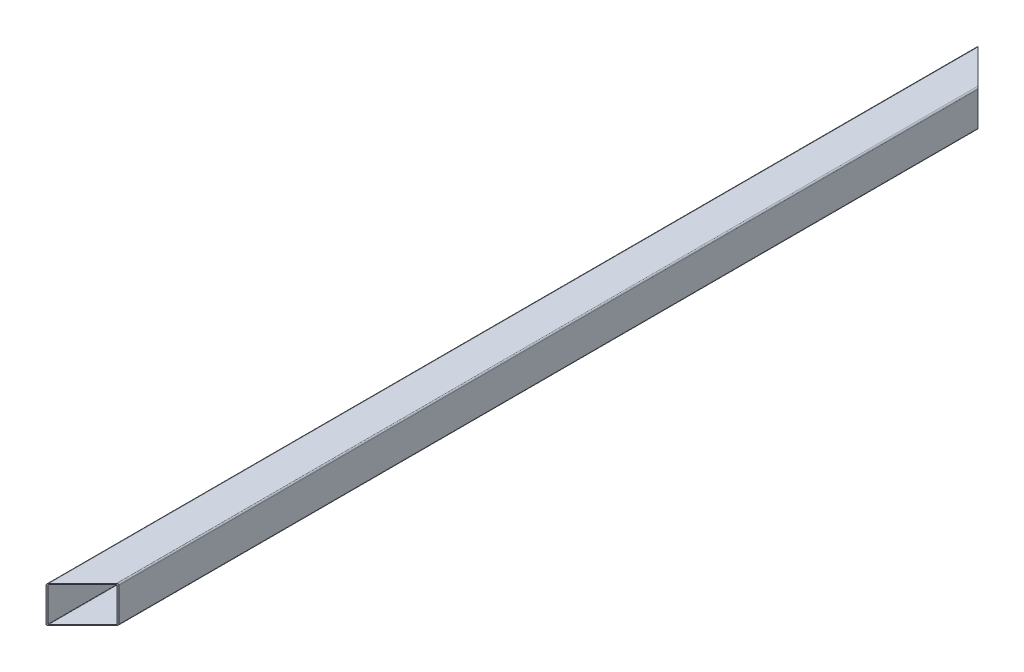
ISO-10303-21;
HEADER;
FILE_DESCRIPTION(('STEP AP214'),'2;1');
FILE_NAME('part.step','',(''),(''),'','','');
FILE_SCHEMA(('AUTOMOTIVE_DESIGN { 1 0 10303 214 1 1 1 1 }'));
ENDSEC;
DATA;
#1=APPLICATION_CONTEXT('core data for automotive mechanical design processes');
#2=APPLICATION_PROTOCOL_DEFINITION('international standard','automotive_design',2000,#1);
#3=PRODUCT_CONTEXT('',#1,'mechanical');
#4=PRODUCT('Part','Part','',(#3));
#5=PRODUCT_RELATED_PRODUCT_CATEGORY('part','',(#4));
#6=PRODUCT_DEFINITION_FORMATION('','',#4);
#7=PRODUCT_DEFINITION_CONTEXT('part definition',#1,'design');
#8=PRODUCT_DEFINITION('design','',#6,#7);
#9=PRODUCT_DEFINITION_SHAPE('','',#8);
#10=(LENGTH_UNIT() NAMED_UNIT(*) SI_UNIT(.MILLI.,.METRE.));
#11=(NAMED_UNIT(*) PLANE_ANGLE_UNIT() SI_UNIT($,.RADIAN.));
#12=(NAMED_UNIT(*) SI_UNIT($,.STERADIAN.) SOLID_ANGLE_UNIT());
#13=UNCERTAINTY_MEASURE_WITH_UNIT(LENGTH_MEASURE(1.E-05),#10,'distance_accuracy_value','');
#14=(GEOMETRIC_REPRESENTATION_CONTEXT(3) GLOBAL_UNCERTAINTY_ASSIGNED_CONTEXT((#13)) GLOBAL_UNIT_ASSIGNED_CONTEXT((#10,
#11,#12)) REPRESENTATION_CONTEXT('',''));
#15=CARTESIAN_POINT('',(0.,0.,0.));
#16=DIRECTION('',(0.,0.,1.));
#17=DIRECTION('',(1.,0.,0.));
#18=AXIS2_PLACEMENT_3D('',#15,#16,#17);
#19=CARTESIAN_POINT('',(-18.5,18.5,-1020.));
#20=DIRECTION('',(0.,0.,1.));
#21=DIRECTION('',(1.,0.,0.));
#22=AXIS2_PLACEMENT_3D('',#19,#20,#21);
#23=CYLINDRICAL_SURFACE('',#22,1.5);
#24=DIRECTION('',(0.,0.,1.));
#25=VECTOR('',#24,1.);
#26=CARTESIAN_POINT('',(-20.,18.5,-1020.));
#27=LINE('',#26,#25);
#28=CARTESIAN_POINT('',(-20.,18.5,-1020.));
#29=VERTEX_POINT('',#28);
#30=CARTESIAN_POINT('',(-20.,18.5,0.));
#31=VERTEX_POINT('',#30);
#32=EDGE_CURVE('E201',#29,#31,#27,.T.);
#33=ORIENTED_EDGE('',*,*,#32,.T.);
#34=CARTESIAN_POINT('',(-18.5,18.5,-1.50000000000006));
#35=DIRECTION('',(-0.707106781186549,0.,-0.707106781186546));
#36=DIRECTION('',(-0.707106781186546,0.,0.707106781186549));
#37=AXIS2_PLACEMENT_3D('',#34,#35,#36);
#38=ELLIPSE('',#37,2.12132034355964,1.5);
#39=CARTESIAN_POINT('',(-18.5,20.,-1.49999999999995));
#40=VERTEX_POINT('',#39);
#41=EDGE_CURVE('E181',#31,#40,#38,.T.);
#42=ORIENTED_EDGE('',*,*,#41,.T.);
#43=DIRECTION('',(0.,0.,1.));
#44=VECTOR('',#43,1.);
#45=CARTESIAN_POINT('',(-18.5,20.,-1020.));
#46=LINE('',#45,#44);
#47=CARTESIAN_POINT('',(-18.5,20.,-1018.5));
#48=VERTEX_POINT('',#47);
#49=EDGE_CURVE('E12',#48,#40,#46,.T.);
#50=ORIENTED_EDGE('',*,*,#49,.F.);
#51=CARTESIAN_POINT('',(-18.5,18.5,-1018.5));
#52=DIRECTION('',(-0.707106781186539,0.,0.707106781186556));
#53=DIRECTION('',(0.707106781186556,0.,0.707106781186539));
#54=AXIS2_PLACEMENT_3D('',#51,#52,#53);
#55=ELLIPSE('',#54,2.12132034355961,1.5);
#56=EDGE_CURVE('E187',#48,#29,#55,.T.);
#57=ORIENTED_EDGE('',*,*,#56,.T.);
#58=EDGE_LOOP('',(#33,#42,#50,#57));
#59=FACE_BOUND('',#58,.T.);
#60=ADVANCED_FACE('F61',(#59),#23,.T.);
#61=CARTESIAN_POINT('',(-18.5,20.,-1020.));
#62=DIRECTION('',(0.,-1.,0.));
#63=DIRECTION('',(0.,0.,-1.));
#64=AXIS2_PLACEMENT_3D('',#61,#62,#63);
#65=PLANE('',#64);
#66=ORIENTED_EDGE('',*,*,#49,.T.);
#67=DIRECTION('',(0.707106781186546,0.,-0.707106781186549));
#68=VECTOR('',#67,1.);
#69=CARTESIAN_POINT('',(490.75,20.,-510.750000000002));
#70=LINE('',#69,#68);
#71=CARTESIAN_POINT('',(18.5,20.,-38.5000000000002));
#72=VERTEX_POINT('',#71);
#73=EDGE_CURVE('E267',#40,#72,#70,.T.);
#74=ORIENTED_EDGE('',*,*,#73,.T.);
#75=DIRECTION('',(0.,0.,1.));
#76=VECTOR('',#75,1.);
#77=CARTESIAN_POINT('',(18.5,20.,-1020.));
#78=LINE('',#77,#76);
#79=CARTESIAN_POINT('',(18.5,20.,-981.500000000001));
#80=VERTEX_POINT('',#79);
#81=EDGE_CURVE('E70',#80,#72,#78,.T.);
#82=ORIENTED_EDGE('',*,*,#81,.F.);
#83=DIRECTION('',(-0.707106781186556,0.,-0.707106781186539));
#84=VECTOR('',#83,1.);
#85=CARTESIAN_POINT('',(-19.25,20.,-1019.25));
#86=LINE('',#85,#84);
#87=EDGE_CURVE('E298',#80,#48,#86,.T.);
#88=ORIENTED_EDGE('',*,*,#87,.T.);
#89=EDGE_LOOP('',(#66,#74,#82,#88));
#90=FACE_BOUND('',#89,.T.);
#91=ADVANCED_FACE('F308',(#90),#65,.F.);
#92=CARTESIAN_POINT('',(18.5,18.5,-1020.));
#93=DIRECTION('',(0.,0.,1.));
#94=DIRECTION('',(1.,0.,0.));
#95=AXIS2_PLACEMENT_3D('',#92,#93,#94);
#96=CYLINDRICAL_SURFACE('',#95,1.5);
#97=ORIENTED_EDGE('',*,*,#81,.T.);
#98=CARTESIAN_POINT('',(18.5,18.5,-38.5000000000002));
#99=DIRECTION('',(-0.707106781186549,0.,-0.707106781186546));
#100=DIRECTION('',(-0.707106781186546,0.,0.707106781186549));
#101=AXIS2_PLACEMENT_3D('',#98,#99,#100);
#102=ELLIPSE('',#101,2.12132034355964,1.5);
#103=CARTESIAN_POINT('',(20.,18.5,-40.0000000000001));
#104=VERTEX_POINT('',#103);
#105=EDGE_CURVE('E264',#72,#104,#102,.T.);
#106=ORIENTED_EDGE('',*,*,#105,.T.);
#107=DIRECTION('',(0.,0.,1.));
#108=VECTOR('',#107,1.);
#109=CARTESIAN_POINT('',(20.,18.5,-1020.));
#110=LINE('',#109,#108);
#111=CARTESIAN_POINT('',(20.,18.5,-980.000000000001));
#112=VERTEX_POINT('',#111);
#113=EDGE_CURVE('E212',#112,#104,#110,.T.);
#114=ORIENTED_EDGE('',*,*,#113,.F.);
#115=CARTESIAN_POINT('',(18.5,18.5,-981.500000000001));
#116=DIRECTION('',(-0.707106781186539,0.,0.707106781186556));
#117=DIRECTION('',(0.707106781186556,0.,0.707106781186539));
#118=AXIS2_PLACEMENT_3D('',#115,#116,#117);
#119=ELLIPSE('',#118,2.12132034355961,1.5);
#120=EDGE_CURVE('E295',#112,#80,#119,.T.);
#121=ORIENTED_EDGE('',*,*,#120,.T.);
#122=EDGE_LOOP('',(#97,#106,#114,#121));
#123=FACE_BOUND('',#122,.T.);
#124=ADVANCED_FACE('F312',(#123),#96,.T.);
#125=CARTESIAN_POINT('',(20.,-18.5,-1020.));
#126=DIRECTION('',(-1.,0.,0.));
#127=DIRECTION('',(0.,0.,1.));
#128=AXIS2_PLACEMENT_3D('',#125,#126,#127);
#129=PLANE('',#128);
#130=ORIENTED_EDGE('',*,*,#113,.T.);
#131=DIRECTION('',(0.,-1.,0.));
#132=VECTOR('',#131,1.);
#133=CARTESIAN_POINT('',(20.,-18.5,-40.0000000000001));
#134=LINE('',#133,#132);
#135=CARTESIAN_POINT('',(20.,-18.5,-40.0000000000003));
#136=VERTEX_POINT('',#135);
#137=EDGE_CURVE('E261',#104,#136,#134,.T.);
#138=ORIENTED_EDGE('',*,*,#137,.T.);
#139=DIRECTION('',(0.,0.,1.));
#140=VECTOR('',#139,1.);
#141=CARTESIAN_POINT('',(20.,-18.5,-1020.));
#142=LINE('',#141,#140);
#143=CARTESIAN_POINT('',(20.,-18.5,-980.000000000001));
#144=VERTEX_POINT('',#143);
#145=EDGE_CURVE('E209',#144,#136,#142,.T.);
#146=ORIENTED_EDGE('',*,*,#145,.F.);
#147=DIRECTION('',(0.,1.,0.));
#148=VECTOR('',#147,1.);
#149=CARTESIAN_POINT('',(20.,-18.5,-980.000000000001));
#150=LINE('',#149,#148);
#151=EDGE_CURVE('E292',#144,#112,#150,.T.);
#152=ORIENTED_EDGE('',*,*,#151,.T.);
#153=EDGE_LOOP('',(#130,#138,#146,#152));
#154=FACE_BOUND('',#153,.T.);
#155=ADVANCED_FACE('F314',(#154),#129,.F.);
#156=CARTESIAN_POINT('',(18.5,-18.5,-1020.));
#157=DIRECTION('',(0.,0.,1.));
#158=DIRECTION('',(1.,0.,0.));
#159=AXIS2_PLACEMENT_3D('',#156,#157,#158);
#160=CYLINDRICAL_SURFACE('',#159,1.5);
#161=ORIENTED_EDGE('',*,*,#145,.T.);
#162=CARTESIAN_POINT('',(18.5,-18.5,-38.5000000000002));
#163=DIRECTION('',(-0.707106781186549,0.,-0.707106781186546));
#164=DIRECTION('',(-0.707106781186546,0.,0.707106781186549));
#165=AXIS2_PLACEMENT_3D('',#162,#163,#164);
#166=ELLIPSE('',#165,2.12132034355965,1.5);
#167=CARTESIAN_POINT('',(18.5,-20.,-38.5000000000001));
#168=VERTEX_POINT('',#167);
#169=EDGE_CURVE('E258',#136,#168,#166,.T.);
#170=ORIENTED_EDGE('',*,*,#169,.T.);
#171=DIRECTION('',(0.,0.,1.));
#172=VECTOR('',#171,1.);
#173=CARTESIAN_POINT('',(18.5,-20.,-1020.));
#174=LINE('',#173,#172);
#175=CARTESIAN_POINT('',(18.5,-20.,-981.500000000001));
#176=VERTEX_POINT('',#175);
#177=EDGE_CURVE('E203',#176,#168,#174,.T.);
#178=ORIENTED_EDGE('',*,*,#177,.F.);
#179=CARTESIAN_POINT('',(18.5,-18.5,-981.500000000001));
#180=DIRECTION('',(-0.707106781186539,0.,0.707106781186556));
#181=DIRECTION('',(0.707106781186556,0.,0.707106781186539));
#182=AXIS2_PLACEMENT_3D('',#179,#180,#181);
#183=ELLIPSE('',#182,2.12132034355962,1.5);
#184=EDGE_CURVE('E289',#176,#144,#183,.T.);
#185=ORIENTED_EDGE('',*,*,#184,.T.);
#186=EDGE_LOOP('',(#161,#170,#178,#185));
#187=FACE_BOUND('',#186,.T.);
#188=ADVANCED_FACE('F318',(#187),#160,.T.);
#189=CARTESIAN_POINT('',(18.5,-20.,-1020.));
#190=DIRECTION('',(0.,1.,0.));
#191=DIRECTION('',(0.,0.,1.));
#192=AXIS2_PLACEMENT_3D('',#189,#190,#191);
#193=PLANE('',#192);
#194=ORIENTED_EDGE('',*,*,#177,.T.);
#195=DIRECTION('',(-0.707106781186546,0.,0.707106781186549));
#196=VECTOR('',#195,1.);
#197=CARTESIAN_POINT('',(509.25,-20.,-529.250000000002));
#198=LINE('',#197,#196);
#199=CARTESIAN_POINT('',(-18.5,-20.,-1.50000000000006));
#200=VERTEX_POINT('',#199);
#201=EDGE_CURVE('E198',#168,#200,#198,.T.);
#202=ORIENTED_EDGE('',*,*,#201,.T.);
#203=DIRECTION('',(0.,0.,1.));
#204=VECTOR('',#203,1.);
#205=CARTESIAN_POINT('',(-18.5,-20.,-1020.));
#206=LINE('',#205,#204);
#207=CARTESIAN_POINT('',(-18.5,-20.,-1018.5));
#208=VERTEX_POINT('',#207);
#209=EDGE_CURVE('E197',#208,#200,#206,.T.);
#210=ORIENTED_EDGE('',*,*,#209,.F.);
#211=DIRECTION('',(0.707106781186556,0.,0.707106781186539));
#212=VECTOR('',#211,1.);
#213=CARTESIAN_POINT('',(-0.749999999999532,-20.,-1000.75));
#214=LINE('',#213,#212);
#215=EDGE_CURVE('E286',#208,#176,#214,.T.);
#216=ORIENTED_EDGE('',*,*,#215,.T.);
#217=EDGE_LOOP('',(#194,#202,#210,#216));
#218=FACE_BOUND('',#217,.T.);
#219=ADVANCED_FACE('F320',(#218),#193,.F.);
#220=CARTESIAN_POINT('',(-18.5,-18.5,-1020.));
#221=DIRECTION('',(0.,0.,1.));
#222=DIRECTION('',(1.,0.,0.));
#223=AXIS2_PLACEMENT_3D('',#220,#221,#222);
#224=CYLINDRICAL_SURFACE('',#223,1.5);
#225=ORIENTED_EDGE('',*,*,#209,.T.);
#226=CARTESIAN_POINT('',(-18.5,-18.5,-1.50000000000006));
#227=DIRECTION('',(-0.707106781186549,0.,-0.707106781186546));
#228=DIRECTION('',(-0.707106781186546,0.,0.707106781186549));
#229=AXIS2_PLACEMENT_3D('',#226,#227,#228);
#230=ELLIPSE('',#229,2.12132034355965,1.5);
#231=CARTESIAN_POINT('',(-20.,-18.5,0.));
#232=VERTEX_POINT('',#231);
#233=EDGE_CURVE('E178',#200,#232,#230,.T.);
#234=ORIENTED_EDGE('',*,*,#233,.T.);
#235=DIRECTION('',(0.,0.,1.));
#236=VECTOR('',#235,1.);
#237=CARTESIAN_POINT('',(-20.,-18.5,-1020.));
#238=LINE('',#237,#236);
#239=CARTESIAN_POINT('',(-20.,-18.5,-1020.));
#240=VERTEX_POINT('',#239);
#241=EDGE_CURVE('E194',#240,#232,#238,.T.);
#242=ORIENTED_EDGE('',*,*,#241,.F.);
#243=CARTESIAN_POINT('',(-18.5,-18.5,-1018.5));
#244=DIRECTION('',(-0.707106781186539,0.,0.707106781186556));
#245=DIRECTION('',(0.707106781186556,0.,0.707106781186539));
#246=AXIS2_PLACEMENT_3D('',#243,#244,#245);
#247=ELLIPSE('',#246,2.12132034355962,1.5);
#248=EDGE_CURVE('E284',#240,#208,#247,.T.);
#249=ORIENTED_EDGE('',*,*,#248,.T.);
#250=EDGE_LOOP('',(#225,#234,#242,#249));
#251=FACE_BOUND('',#250,.T.);
#252=ADVANCED_FACE('F192',(#251),#224,.T.);
#253=CARTESIAN_POINT('',(18.5,18.5,-1020.));
#254=DIRECTION('',(0.,0.,1.));
#255=DIRECTION('',(1.,0.,0.));
#256=AXIS2_PLACEMENT_3D('',#253,#254,#255);
#257=CYLINDRICAL_SURFACE('',#256,0.3);
#258=CARTESIAN_POINT('',(18.5,18.5,-38.5000000000002));
#259=DIRECTION('',(-0.707106781186549,0.,-0.707106781186546));
#260=DIRECTION('',(-0.707106781186546,0.,0.707106781186549));
#261=AXIS2_PLACEMENT_3D('',#258,#259,#260);
#262=ELLIPSE('',#261,0.424264068711929,0.3);
#263=CARTESIAN_POINT('',(18.5,18.8,-38.5000000000001));
#264=VERTEX_POINT('',#263);
#265=CARTESIAN_POINT('',(18.8,18.5,-38.8000000000002));
#266=VERTEX_POINT('',#265);
#267=EDGE_CURVE('E78',#264,#266,#262,.T.);
#268=ORIENTED_EDGE('',*,*,#267,.F.);
#269=DIRECTION('',(0.,0.,1.));
#270=VECTOR('',#269,1.);
#271=CARTESIAN_POINT('',(18.5,18.8,-1020.));
#272=LINE('',#271,#270);
#273=CARTESIAN_POINT('',(18.5,18.8,-981.500000000001));
#274=VERTEX_POINT('',#273);
#275=EDGE_CURVE('E65',#274,#264,#272,.T.);
#276=ORIENTED_EDGE('',*,*,#275,.F.);
#277=CARTESIAN_POINT('',(18.5,18.5,-981.500000000001));
#278=DIRECTION('',(-0.707106781186539,0.,0.707106781186556));
#279=DIRECTION('',(0.707106781186556,0.,0.707106781186539));
#280=AXIS2_PLACEMENT_3D('',#277,#278,#279);
#281=ELLIPSE('',#280,0.424264068711923,0.3);
#282=CARTESIAN_POINT('',(18.8,18.5,-981.200000000001));
#283=VERTEX_POINT('',#282);
#284=EDGE_CURVE('E250',#283,#274,#281,.T.);
#285=ORIENTED_EDGE('',*,*,#284,.F.);
#286=DIRECTION('',(0.,0.,1.));
#287=VECTOR('',#286,1.);
#288=CARTESIAN_POINT('',(18.8,18.5,-1020.));
#289=LINE('',#288,#287);
#290=EDGE_CURVE('E217',#283,#266,#289,.T.);
#291=ORIENTED_EDGE('',*,*,#290,.T.);
#292=EDGE_LOOP('',(#268,#276,#285,#291));
#293=FACE_BOUND('',#292,.T.);
#294=ADVANCED_FACE('F63',(#293),#257,.F.);
#295=CARTESIAN_POINT('',(-18.5,18.8,-1020.));
#296=DIRECTION('',(0.,-1.,0.));
#297=DIRECTION('',(0.,0.,-1.));
#298=AXIS2_PLACEMENT_3D('',#295,#296,#297);
#299=PLANE('',#298);
#300=DIRECTION('',(0.707106781186546,0.,-0.707106781186549));
#301=VECTOR('',#300,1.);
#302=CARTESIAN_POINT('',(490.75,18.8,-510.750000000002));
#303=LINE('',#302,#301);
#304=CARTESIAN_POINT('',(-18.5,18.8,-1.50000000000006));
#305=VERTEX_POINT('',#304);
#306=EDGE_CURVE('E246',#305,#264,#303,.T.);
#307=ORIENTED_EDGE('',*,*,#306,.F.);
#308=DIRECTION('',(0.,0.,1.));
#309=VECTOR('',#308,1.);
#310=CARTESIAN_POINT('',(-18.5,18.8,-1020.));
#311=LINE('',#310,#309);
#312=CARTESIAN_POINT('',(-18.5,18.8,-1018.5));
#313=VERTEX_POINT('',#312);
#314=EDGE_CURVE('E234',#313,#305,#311,.T.);
#315=ORIENTED_EDGE('',*,*,#314,.F.);
#316=DIRECTION('',(-0.707106781186556,0.,-0.707106781186539));
#317=VECTOR('',#316,1.);
#318=CARTESIAN_POINT('',(-19.25,18.8,-1019.25));
#319=LINE('',#318,#317);
#320=EDGE_CURVE('E247',#274,#313,#319,.T.);
#321=ORIENTED_EDGE('',*,*,#320,.F.);
#322=ORIENTED_EDGE('',*,*,#275,.T.);
#323=EDGE_LOOP('',(#307,#315,#321,#322));
#324=FACE_BOUND('',#323,.T.);
#325=ADVANCED_FACE('F245',(#324),#299,.T.);
#326=CARTESIAN_POINT('',(-18.5,18.5,-1020.));
#327=DIRECTION('',(0.,0.,1.));
#328=DIRECTION('',(1.,0.,0.));
#329=AXIS2_PLACEMENT_3D('',#326,#327,#328);
#330=CYLINDRICAL_SURFACE('',#329,0.3);
#331=CARTESIAN_POINT('',(-18.5,18.5,-1.50000000000006));
#332=DIRECTION('',(-0.707106781186549,0.,-0.707106781186546));
#333=DIRECTION('',(-0.707106781186546,0.,0.707106781186549));
#334=AXIS2_PLACEMENT_3D('',#331,#332,#333);
#335=ELLIPSE('',#334,0.424264068711929,0.3);
#336=CARTESIAN_POINT('',(-18.8,18.5,-1.20000000000009));
#337=VERTEX_POINT('',#336);
#338=EDGE_CURVE('E253',#337,#305,#335,.T.);
#339=ORIENTED_EDGE('',*,*,#338,.F.);
#340=DIRECTION('',(0.,0.,1.));
#341=VECTOR('',#340,1.);
#342=CARTESIAN_POINT('',(-18.8,18.5,-1020.));
#343=LINE('',#342,#341);
#344=CARTESIAN_POINT('',(-18.8,18.5,-1018.8));
#345=VERTEX_POINT('',#344);
#346=EDGE_CURVE('E232',#345,#337,#343,.T.);
#347=ORIENTED_EDGE('',*,*,#346,.F.);
#348=CARTESIAN_POINT('',(-18.5,18.5,-1018.5));
#349=DIRECTION('',(-0.707106781186539,0.,0.707106781186556));
#350=DIRECTION('',(0.707106781186556,0.,0.707106781186539));
#351=AXIS2_PLACEMENT_3D('',#348,#349,#350);
#352=ELLIPSE('',#351,0.424264068711923,0.3);
#353=EDGE_CURVE('E280',#313,#345,#352,.T.);
#354=ORIENTED_EDGE('',*,*,#353,.F.);
#355=ORIENTED_EDGE('',*,*,#314,.T.);
#356=EDGE_LOOP('',(#339,#347,#354,#355));
#357=FACE_BOUND('',#356,.T.);
#358=ADVANCED_FACE('F356',(#357),#330,.F.);
#359=CARTESIAN_POINT('',(-18.8,18.5,-1020.));
#360=DIRECTION('',(1.,0.,0.));
#361=DIRECTION('',(0.,0.,-1.));
#362=AXIS2_PLACEMENT_3D('',#359,#360,#361);
#363=PLANE('',#362);
#364=DIRECTION('',(0.,1.,0.));
#365=VECTOR('',#364,1.);
#366=CARTESIAN_POINT('',(-18.8,18.5,-1.20000000000009));
#367=LINE('',#366,#365);
#368=CARTESIAN_POINT('',(-18.8,-18.5,-1.20000000000009));
#369=VERTEX_POINT('',#368);
#370=EDGE_CURVE('E513',#369,#337,#367,.T.);
#371=ORIENTED_EDGE('',*,*,#370,.F.);
#372=DIRECTION('',(0.,0.,1.));
#373=VECTOR('',#372,1.);
#374=CARTESIAN_POINT('',(-18.8,-18.5,-1020.));
#375=LINE('',#374,#373);
#376=CARTESIAN_POINT('',(-18.8,-18.5,-1018.8));
#377=VERTEX_POINT('',#376);
#378=EDGE_CURVE('E229',#377,#369,#375,.T.);
#379=ORIENTED_EDGE('',*,*,#378,.F.);
#380=DIRECTION('',(0.,-1.,0.));
#381=VECTOR('',#380,1.);
#382=CARTESIAN_POINT('',(-18.8,18.5,-1018.8));
#383=LINE('',#382,#381);
#384=EDGE_CURVE('E278',#345,#377,#383,.T.);
#385=ORIENTED_EDGE('',*,*,#384,.F.);
#386=ORIENTED_EDGE('',*,*,#346,.T.);
#387=EDGE_LOOP('',(#371,#379,#385,#386));
#388=FACE_BOUND('',#387,.T.);
#389=ADVANCED_FACE('F352',(#388),#363,.T.);
#390=CARTESIAN_POINT('',(-18.5,-18.5,-1020.));
#391=DIRECTION('',(0.,0.,1.));
#392=DIRECTION('',(1.,0.,0.));
#393=AXIS2_PLACEMENT_3D('',#390,#391,#392);
#394=CYLINDRICAL_SURFACE('',#393,0.300000000000005);
#395=CARTESIAN_POINT('',(-18.5,-18.5,-1.50000000000006));
#396=DIRECTION('',(-0.707106781186549,0.,-0.707106781186546));
#397=DIRECTION('',(-0.707106781186546,0.,0.707106781186549));
#398=AXIS2_PLACEMENT_3D('',#395,#396,#397);
#399=ELLIPSE('',#398,0.424264068711936,0.300000000000005);
#400=CARTESIAN_POINT('',(-18.5,-18.8,-1.49999999999995));
#401=VERTEX_POINT('',#400);
#402=EDGE_CURVE('E508',#401,#369,#399,.T.);
#403=ORIENTED_EDGE('',*,*,#402,.F.);
#404=DIRECTION('',(0.,0.,1.));
#405=VECTOR('',#404,1.);
#406=CARTESIAN_POINT('',(-18.5,-18.8,-1020.));
#407=LINE('',#406,#405);
#408=CARTESIAN_POINT('',(-18.5,-18.8,-1018.5));
#409=VERTEX_POINT('',#408);
#410=EDGE_CURVE('E226',#409,#401,#407,.T.);
#411=ORIENTED_EDGE('',*,*,#410,.F.);
#412=CARTESIAN_POINT('',(-18.5,-18.5,-1018.5));
#413=DIRECTION('',(-0.707106781186539,0.,0.707106781186556));
#414=DIRECTION('',(0.707106781186556,0.,0.707106781186539));
#415=AXIS2_PLACEMENT_3D('',#412,#413,#414);
#416=ELLIPSE('',#415,0.424264068711931,0.300000000000005);
#417=EDGE_CURVE('E276',#377,#409,#416,.T.);
#418=ORIENTED_EDGE('',*,*,#417,.F.);
#419=ORIENTED_EDGE('',*,*,#378,.T.);
#420=EDGE_LOOP('',(#403,#411,#418,#419));
#421=FACE_BOUND('',#420,.T.);
#422=ADVANCED_FACE('F348',(#421),#394,.F.);
#423=CARTESIAN_POINT('',(18.5,-18.8,-1020.));
#424=DIRECTION('',(0.,1.,0.));
#425=DIRECTION('',(0.,0.,1.));
#426=AXIS2_PLACEMENT_3D('',#423,#424,#425);
#427=PLANE('',#426);
#428=DIRECTION('',(-0.707106781186546,0.,0.707106781186549));
#429=VECTOR('',#428,1.);
#430=CARTESIAN_POINT('',(509.25,-18.8,-529.250000000002));
#431=LINE('',#430,#429);
#432=CARTESIAN_POINT('',(18.5,-18.8,-38.5000000000002));
#433=VERTEX_POINT('',#432);
#434=EDGE_CURVE('E505',#433,#401,#431,.T.);
#435=ORIENTED_EDGE('',*,*,#434,.F.);
#436=DIRECTION('',(0.,0.,1.));
#437=VECTOR('',#436,1.);
#438=CARTESIAN_POINT('',(18.5,-18.8,-1020.));
#439=LINE('',#438,#437);
#440=CARTESIAN_POINT('',(18.5,-18.8,-981.500000000001));
#441=VERTEX_POINT('',#440);
#442=EDGE_CURVE('E223',#441,#433,#439,.T.);
#443=ORIENTED_EDGE('',*,*,#442,.F.);
#444=DIRECTION('',(0.707106781186556,0.,0.707106781186539));
#445=VECTOR('',#444,1.);
#446=CARTESIAN_POINT('',(-0.749999999999532,-18.8,-1000.75));
#447=LINE('',#446,#445);
#448=EDGE_CURVE('E274',#409,#441,#447,.T.);
#449=ORIENTED_EDGE('',*,*,#448,.F.);
#450=ORIENTED_EDGE('',*,*,#410,.T.);
#451=EDGE_LOOP('',(#435,#443,#449,#450));
#452=FACE_BOUND('',#451,.T.);
#453=ADVANCED_FACE('F344',(#452),#427,.T.);
#454=CARTESIAN_POINT('',(18.5,-18.5,-1020.));
#455=DIRECTION('',(0.,0.,1.));
#456=DIRECTION('',(1.,0.,0.));
#457=AXIS2_PLACEMENT_3D('',#454,#455,#456);
#458=CYLINDRICAL_SURFACE('',#457,0.300000000000003);
#459=CARTESIAN_POINT('',(18.5,-18.5,-38.5000000000002));
#460=DIRECTION('',(-0.707106781186549,0.,-0.707106781186546));
#461=DIRECTION('',(-0.707106781186546,0.,0.707106781186549));
#462=AXIS2_PLACEMENT_3D('',#459,#460,#461);
#463=ELLIPSE('',#462,0.424264068711934,0.300000000000003);
#464=CARTESIAN_POINT('',(18.8,-18.5,-38.8000000000002));
#465=VERTEX_POINT('',#464);
#466=EDGE_CURVE('E503',#465,#433,#463,.T.);
#467=ORIENTED_EDGE('',*,*,#466,.F.);
#468=DIRECTION('',(0.,0.,1.));
#469=VECTOR('',#468,1.);
#470=CARTESIAN_POINT('',(18.8,-18.5,-1020.));
#471=LINE('',#470,#469);
#472=CARTESIAN_POINT('',(18.8,-18.5,-981.200000000001));
#473=VERTEX_POINT('',#472);
#474=EDGE_CURVE('E220',#473,#465,#471,.T.);
#475=ORIENTED_EDGE('',*,*,#474,.F.);
#476=CARTESIAN_POINT('',(18.5,-18.5,-981.500000000001));
#477=DIRECTION('',(-0.707106781186539,0.,0.707106781186556));
#478=DIRECTION('',(0.707106781186556,0.,0.707106781186539));
#479=AXIS2_PLACEMENT_3D('',#476,#477,#478);
#480=ELLIPSE('',#479,0.424264068711928,0.300000000000003);
#481=EDGE_CURVE('E86',#441,#473,#480,.T.);
#482=ORIENTED_EDGE('',*,*,#481,.F.);
#483=ORIENTED_EDGE('',*,*,#442,.T.);
#484=EDGE_LOOP('',(#467,#475,#482,#483));
#485=FACE_BOUND('',#484,.T.);
#486=ADVANCED_FACE('F340',(#485),#458,.F.);
#487=CARTESIAN_POINT('',(18.8,-18.5,-1020.));
#488=DIRECTION('',(-1.,0.,0.));
#489=DIRECTION('',(0.,0.,1.));
#490=AXIS2_PLACEMENT_3D('',#487,#488,#489);
#491=PLANE('',#490);
#492=DIRECTION('',(0.,-1.,0.));
#493=VECTOR('',#492,1.);
#494=CARTESIAN_POINT('',(18.8,-18.5,-38.8000000000002));
#495=LINE('',#494,#493);
#496=EDGE_CURVE('E506',#266,#465,#495,.T.);
#497=ORIENTED_EDGE('',*,*,#496,.F.);
#498=ORIENTED_EDGE('',*,*,#290,.F.);
#499=DIRECTION('',(0.,1.,0.));
#500=VECTOR('',#499,1.);
#501=CARTESIAN_POINT('',(18.8,-18.5,-981.200000000001));
#502=LINE('',#501,#500);
#503=EDGE_CURVE('E271',#473,#283,#502,.T.);
#504=ORIENTED_EDGE('',*,*,#503,.F.);
#505=ORIENTED_EDGE('',*,*,#474,.T.);
#506=EDGE_LOOP('',(#497,#498,#504,#505));
#507=FACE_BOUND('',#506,.T.);
#508=ADVANCED_FACE('F337',(#507),#491,.T.);
#509=CARTESIAN_POINT('',(-20.,18.5,-1020.));
#510=DIRECTION('',(1.,0.,0.));
#511=DIRECTION('',(0.,0.,-1.));
#512=AXIS2_PLACEMENT_3D('',#509,#510,#511);
#513=PLANE('',#512);
#514=DIRECTION('',(0.,1.,0.));
#515=VECTOR('',#514,1.);
#516=CARTESIAN_POINT('',(-20.,18.5,0.));
#517=LINE('',#516,#515);
#518=EDGE_CURVE('E175',#232,#31,#517,.T.);
#519=ORIENTED_EDGE('',*,*,#518,.T.);
#520=ORIENTED_EDGE('',*,*,#32,.F.);
#521=DIRECTION('',(0.,1.,0.));
#522=VECTOR('',#521,1.);
#523=CARTESIAN_POINT('',(-20.,18.5,-1020.));
#524=LINE('',#523,#522);
#525=EDGE_CURVE('E186',#240,#29,#524,.T.);
#526=ORIENTED_EDGE('',*,*,#525,.F.);
#527=ORIENTED_EDGE('',*,*,#241,.T.);
#528=EDGE_LOOP('',(#519,#520,#526,#527));
#529=FACE_BOUND('',#528,.T.);
#530=ADVANCED_FACE('F200',(#529),#513,.F.);
#531=CARTESIAN_POINT('',(-20.,-70.,-1020.));
#532=DIRECTION('',(-0.707106781186539,0.,0.707106781186556));
#533=DIRECTION('',(0.707106781186556,0.,0.707106781186539));
#534=AXIS2_PLACEMENT_3D('',#531,#532,#533);
#535=PLANE('',#534);
#536=ORIENTED_EDGE('',*,*,#284,.T.);
#537=ORIENTED_EDGE('',*,*,#320,.T.);
#538=ORIENTED_EDGE('',*,*,#353,.T.);
#539=ORIENTED_EDGE('',*,*,#384,.T.);
#540=ORIENTED_EDGE('',*,*,#417,.T.);
#541=ORIENTED_EDGE('',*,*,#448,.T.);
#542=ORIENTED_EDGE('',*,*,#481,.T.);
#543=ORIENTED_EDGE('',*,*,#503,.T.);
#544=EDGE_LOOP('',(#536,#537,#538,#539,#540,#541,#542,#543));
#545=FACE_BOUND('',#544,.T.);
#546=ORIENTED_EDGE('',*,*,#87,.F.);
#547=ORIENTED_EDGE('',*,*,#120,.F.);
#548=ORIENTED_EDGE('',*,*,#151,.F.);
#549=ORIENTED_EDGE('',*,*,#184,.F.);
#550=ORIENTED_EDGE('',*,*,#215,.F.);
#551=ORIENTED_EDGE('',*,*,#248,.F.);
#552=ORIENTED_EDGE('',*,*,#525,.T.);
#553=ORIENTED_EDGE('',*,*,#56,.F.);
#554=EDGE_LOOP('',(#546,#547,#548,#549,#550,#551,#552,#553));
#555=FACE_BOUND('',#554,.T.);
#556=ADVANCED_FACE('F304',(#545,#555),#535,.F.);
#557=CARTESIAN_POINT('',(-20.,-70.,0.));
#558=DIRECTION('',(-0.707106781186549,0.,-0.707106781186546));
#559=DIRECTION('',(-0.707106781186546,0.,0.707106781186549));
#560=AXIS2_PLACEMENT_3D('',#557,#558,#559);
#561=PLANE('',#560);
#562=ORIENTED_EDGE('',*,*,#267,.T.);
#563=ORIENTED_EDGE('',*,*,#496,.T.);
#564=ORIENTED_EDGE('',*,*,#466,.T.);
#565=ORIENTED_EDGE('',*,*,#434,.T.);
#566=ORIENTED_EDGE('',*,*,#402,.T.);
#567=ORIENTED_EDGE('',*,*,#370,.T.);
#568=ORIENTED_EDGE('',*,*,#338,.T.);
#569=ORIENTED_EDGE('',*,*,#306,.T.);
#570=EDGE_LOOP('',(#562,#563,#564,#565,#566,#567,#568,#569));
#571=FACE_BOUND('',#570,.T.);
#572=ORIENTED_EDGE('',*,*,#518,.F.);
#573=ORIENTED_EDGE('',*,*,#233,.F.);
#574=ORIENTED_EDGE('',*,*,#201,.F.);
#575=ORIENTED_EDGE('',*,*,#169,.F.);
#576=ORIENTED_EDGE('',*,*,#137,.F.);
#577=ORIENTED_EDGE('',*,*,#105,.F.);
#578=ORIENTED_EDGE('',*,*,#73,.F.);
#579=ORIENTED_EDGE('',*,*,#41,.F.);
#580=EDGE_LOOP('',(#572,#573,#574,#575,#576,#577,#578,#579));
#581=FACE_BOUND('',#580,.T.);
#582=ADVANCED_FACE('F177',(#571,#581),#561,.F.);
#583=CLOSED_SHELL('',(#60,#91,#124,#155,#188,#219,#252,#294,#325,#358,#389,#422,#453,#486,#508,
#530,#556,#582));
#584=MANIFOLD_SOLID_BREP('B2',#583);
#585=ADVANCED_BREP_SHAPE_REPRESENTATION('',(#18,#584),#14);
#586=SHAPE_DEFINITION_REPRESENTATION(#9,#585);
ENDSEC;
END-ISO-10303-21;
